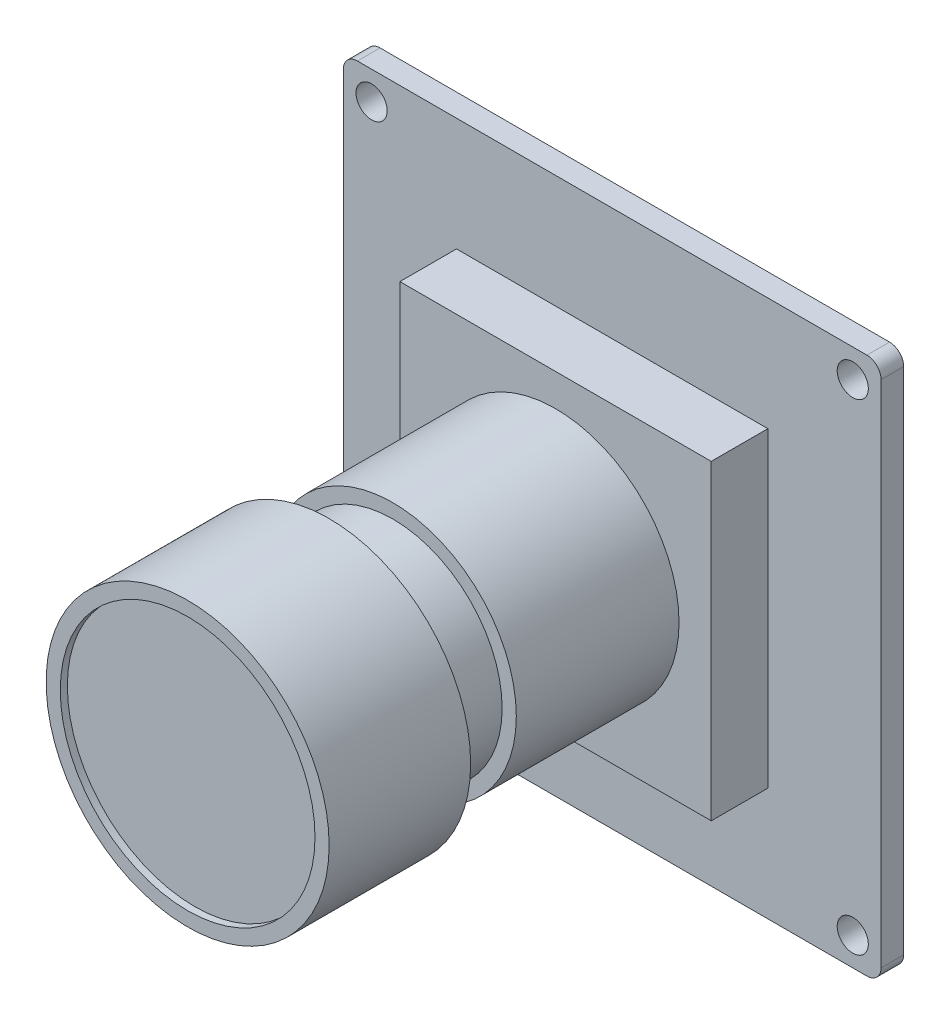
ISO-10303-21;
HEADER;
FILE_DESCRIPTION(('STEP AP214'),'2;1');
FILE_NAME('part.step','',(''),(''),'','','');
FILE_SCHEMA(('AUTOMOTIVE_DESIGN { 1 0 10303 214 1 1 1 1 }'));
ENDSEC;
DATA;
#1=APPLICATION_CONTEXT('core data for automotive mechanical design processes');
#2=APPLICATION_PROTOCOL_DEFINITION('international standard','automotive_design',2000,#1);
#3=PRODUCT_CONTEXT('',#1,'mechanical');
#4=PRODUCT('Part','Part','',(#3));
#5=PRODUCT_RELATED_PRODUCT_CATEGORY('part','',(#4));
#6=PRODUCT_DEFINITION_FORMATION('','',#4);
#7=PRODUCT_DEFINITION_CONTEXT('part definition',#1,'design');
#8=PRODUCT_DEFINITION('design','',#6,#7);
#9=PRODUCT_DEFINITION_SHAPE('','',#8);
#10=(LENGTH_UNIT() NAMED_UNIT(*) SI_UNIT(.MILLI.,.METRE.));
#11=(NAMED_UNIT(*) PLANE_ANGLE_UNIT() SI_UNIT($,.RADIAN.));
#12=(NAMED_UNIT(*) SI_UNIT($,.STERADIAN.) SOLID_ANGLE_UNIT());
#13=UNCERTAINTY_MEASURE_WITH_UNIT(LENGTH_MEASURE(1.E-05),#10,'distance_accuracy_value','');
#14=(GEOMETRIC_REPRESENTATION_CONTEXT(3) GLOBAL_UNCERTAINTY_ASSIGNED_CONTEXT((#13)) GLOBAL_UNIT_ASSIGNED_CONTEXT((#10,
#11,#12)) REPRESENTATION_CONTEXT('',''));
#15=CARTESIAN_POINT('',(0.,0.,0.));
#16=DIRECTION('',(0.,0.,1.));
#17=DIRECTION('',(1.,0.,0.));
#18=AXIS2_PLACEMENT_3D('',#15,#16,#17);
#19=CARTESIAN_POINT('',(0.,0.,31.6));
#20=DIRECTION('',(0.,0.,-1.));
#21=DIRECTION('',(-1.,0.,0.));
#22=AXIS2_PLACEMENT_3D('',#19,#20,#21);
#23=CYLINDRICAL_SURFACE('',#22,7.725);
#24=CARTESIAN_POINT('',(0.,0.,17.1));
#25=DIRECTION('',(0.,0.,1.));
#26=DIRECTION('',(1.,0.,0.));
#27=AXIS2_PLACEMENT_3D('',#24,#25,#26);
#28=CIRCLE('',#27,7.725);
#29=CARTESIAN_POINT('',(7.725,0.,17.1));
#30=VERTEX_POINT('',#29);
#31=EDGE_CURVE('E238',#30,#30,#28,.F.);
#32=ORIENTED_EDGE('',*,*,#31,.F.);
#33=EDGE_LOOP('',(#32));
#34=FACE_BOUND('',#33,.T.);
#35=CARTESIAN_POINT('',(0.,0.,21.6));
#36=DIRECTION('',(0.,0.,1.));
#37=DIRECTION('',(1.,0.,0.));
#38=AXIS2_PLACEMENT_3D('',#35,#36,#37);
#39=CIRCLE('',#38,7.725);
#40=CARTESIAN_POINT('',(7.725,0.,21.6));
#41=VERTEX_POINT('',#40);
#42=EDGE_CURVE('E11',#41,#41,#39,.T.);
#43=ORIENTED_EDGE('',*,*,#42,.F.);
#44=EDGE_LOOP('',(#43));
#45=FACE_BOUND('',#44,.T.);
#46=ADVANCED_FACE('F35',(#34,#45),#23,.T.);
#47=CARTESIAN_POINT('',(0.,0.,1.6));
#48=DIRECTION('',(0.,0.,1.));
#49=DIRECTION('',(1.,0.,0.));
#50=AXIS2_PLACEMENT_3D('',#47,#48,#49);
#51=PLANE('',#50);
#52=CARTESIAN_POINT('',(-17.,-17.,1.6));
#53=DIRECTION('',(0.,0.,1.));
#54=DIRECTION('',(1.,0.,0.));
#55=AXIS2_PLACEMENT_3D('',#52,#53,#54);
#56=CIRCLE('',#55,1.1);
#57=CARTESIAN_POINT('',(-15.9,-17.,1.6));
#58=VERTEX_POINT('',#57);
#59=EDGE_CURVE('E151',#58,#58,#56,.T.);
#60=ORIENTED_EDGE('',*,*,#59,.F.);
#61=EDGE_LOOP('',(#60));
#62=FACE_BOUND('',#61,.T.);
#63=CARTESIAN_POINT('',(17.,17.,1.6));
#64=DIRECTION('',(0.,0.,1.));
#65=DIRECTION('',(1.,0.,0.));
#66=AXIS2_PLACEMENT_3D('',#63,#64,#65);
#67=CIRCLE('',#66,1.1);
#68=CARTESIAN_POINT('',(18.1,17.,1.6));
#69=VERTEX_POINT('',#68);
#70=EDGE_CURVE('E169',#69,#69,#67,.T.);
#71=ORIENTED_EDGE('',*,*,#70,.F.);
#72=EDGE_LOOP('',(#71));
#73=FACE_BOUND('',#72,.T.);
#74=CARTESIAN_POINT('',(17.,-17.,1.6));
#75=DIRECTION('',(0.,0.,1.));
#76=DIRECTION('',(1.,0.,0.));
#77=AXIS2_PLACEMENT_3D('',#74,#75,#76);
#78=CIRCLE('',#77,1.1);
#79=CARTESIAN_POINT('',(18.1,-17.,1.6));
#80=VERTEX_POINT('',#79);
#81=EDGE_CURVE('E163',#80,#80,#78,.T.);
#82=ORIENTED_EDGE('',*,*,#81,.F.);
#83=EDGE_LOOP('',(#82));
#84=FACE_BOUND('',#83,.T.);
#85=CARTESIAN_POINT('',(-17.,17.,1.6));
#86=DIRECTION('',(0.,0.,1.));
#87=DIRECTION('',(1.,0.,0.));
#88=AXIS2_PLACEMENT_3D('',#85,#86,#87);
#89=CIRCLE('',#88,1.1);
#90=CARTESIAN_POINT('',(-15.9,17.,1.6));
#91=VERTEX_POINT('',#90);
#92=EDGE_CURVE('E162',#91,#91,#89,.T.);
#93=ORIENTED_EDGE('',*,*,#92,.F.);
#94=EDGE_LOOP('',(#93));
#95=FACE_BOUND('',#94,.T.);
#96=DIRECTION('',(0.,-1.,0.));
#97=VECTOR('',#96,1.);
#98=CARTESIAN_POINT('',(-19.,19.,1.6));
#99=LINE('',#98,#97);
#100=CARTESIAN_POINT('',(-19.,18.,1.6));
#101=VERTEX_POINT('',#100);
#102=CARTESIAN_POINT('',(-19.,-18.,1.6));
#103=VERTEX_POINT('',#102);
#104=EDGE_CURVE('E180',#101,#103,#99,.T.);
#105=ORIENTED_EDGE('',*,*,#104,.T.);
#106=CARTESIAN_POINT('',(-18.,-18.,1.6));
#107=DIRECTION('',(0.,0.,1.));
#108=DIRECTION('',(1.,0.,0.));
#109=AXIS2_PLACEMENT_3D('',#106,#107,#108);
#110=CIRCLE('',#109,1.);
#111=CARTESIAN_POINT('',(-18.,-19.,1.6));
#112=VERTEX_POINT('',#111);
#113=EDGE_CURVE('E225',#103,#112,#110,.T.);
#114=ORIENTED_EDGE('',*,*,#113,.T.);
#115=DIRECTION('',(1.,0.,0.));
#116=VECTOR('',#115,1.);
#117=CARTESIAN_POINT('',(-19.,-19.,1.6));
#118=LINE('',#117,#116);
#119=CARTESIAN_POINT('',(18.,-19.,1.6));
#120=VERTEX_POINT('',#119);
#121=EDGE_CURVE('E183',#112,#120,#118,.T.);
#122=ORIENTED_EDGE('',*,*,#121,.T.);
#123=CARTESIAN_POINT('',(18.,-18.,1.6));
#124=DIRECTION('',(0.,0.,1.));
#125=DIRECTION('',(1.,0.,0.));
#126=AXIS2_PLACEMENT_3D('',#123,#124,#125);
#127=CIRCLE('',#126,1.);
#128=CARTESIAN_POINT('',(19.,-18.,1.6));
#129=VERTEX_POINT('',#128);
#130=EDGE_CURVE('E223',#120,#129,#127,.T.);
#131=ORIENTED_EDGE('',*,*,#130,.T.);
#132=DIRECTION('',(0.,1.,0.));
#133=VECTOR('',#132,1.);
#134=CARTESIAN_POINT('',(19.,19.,1.6));
#135=LINE('',#134,#133);
#136=CARTESIAN_POINT('',(19.,18.,1.6));
#137=VERTEX_POINT('',#136);
#138=EDGE_CURVE('E187',#129,#137,#135,.T.);
#139=ORIENTED_EDGE('',*,*,#138,.T.);
#140=CARTESIAN_POINT('',(18.,18.,1.6));
#141=DIRECTION('',(0.,0.,1.));
#142=DIRECTION('',(1.,0.,0.));
#143=AXIS2_PLACEMENT_3D('',#140,#141,#142);
#144=CIRCLE('',#143,1.);
#145=CARTESIAN_POINT('',(18.,19.,1.6));
#146=VERTEX_POINT('',#145);
#147=EDGE_CURVE('E221',#137,#146,#144,.T.);
#148=ORIENTED_EDGE('',*,*,#147,.T.);
#149=DIRECTION('',(-1.,0.,0.));
#150=VECTOR('',#149,1.);
#151=CARTESIAN_POINT('',(-19.,19.,1.6));
#152=LINE('',#151,#150);
#153=CARTESIAN_POINT('',(-18.,19.,1.6));
#154=VERTEX_POINT('',#153);
#155=EDGE_CURVE('E190',#146,#154,#152,.T.);
#156=ORIENTED_EDGE('',*,*,#155,.T.);
#157=CARTESIAN_POINT('',(-18.,18.,1.6));
#158=DIRECTION('',(0.,0.,1.));
#159=DIRECTION('',(1.,0.,0.));
#160=AXIS2_PLACEMENT_3D('',#157,#158,#159);
#161=CIRCLE('',#160,1.);
#162=EDGE_CURVE('E219',#154,#101,#161,.T.);
#163=ORIENTED_EDGE('',*,*,#162,.T.);
#164=EDGE_LOOP('',(#105,#114,#122,#131,#139,#148,#156,#163));
#165=FACE_BOUND('',#164,.T.);
#166=DIRECTION('',(1.,0.,0.));
#167=VECTOR('',#166,1.);
#168=CARTESIAN_POINT('',(-11.,-11.,1.6));
#169=LINE('',#168,#167);
#170=CARTESIAN_POINT('',(-11.,-11.,1.6));
#171=VERTEX_POINT('',#170);
#172=CARTESIAN_POINT('',(11.,-11.,1.6));
#173=VERTEX_POINT('',#172);
#174=EDGE_CURVE('E261',#171,#173,#169,.T.);
#175=ORIENTED_EDGE('',*,*,#174,.F.);
#176=DIRECTION('',(0.,-1.,0.));
#177=VECTOR('',#176,1.);
#178=CARTESIAN_POINT('',(-11.,11.,1.6));
#179=LINE('',#178,#177);
#180=CARTESIAN_POINT('',(-11.,11.,1.6));
#181=VERTEX_POINT('',#180);
#182=EDGE_CURVE('E149',#181,#171,#179,.T.);
#183=ORIENTED_EDGE('',*,*,#182,.F.);
#184=DIRECTION('',(-1.,0.,0.));
#185=VECTOR('',#184,1.);
#186=CARTESIAN_POINT('',(-11.,11.,1.6));
#187=LINE('',#186,#185);
#188=CARTESIAN_POINT('',(11.,11.,1.6));
#189=VERTEX_POINT('',#188);
#190=EDGE_CURVE('E145',#189,#181,#187,.T.);
#191=ORIENTED_EDGE('',*,*,#190,.F.);
#192=DIRECTION('',(0.,1.,0.));
#193=VECTOR('',#192,1.);
#194=CARTESIAN_POINT('',(11.,11.,1.6));
#195=LINE('',#194,#193);
#196=EDGE_CURVE('E263',#173,#189,#195,.T.);
#197=ORIENTED_EDGE('',*,*,#196,.F.);
#198=EDGE_LOOP('',(#175,#183,#191,#197));
#199=FACE_BOUND('',#198,.T.);
#200=ADVANCED_FACE('F268',(#62,#73,#84,#95,#165,#199),#51,.T.);
#201=CARTESIAN_POINT('',(-19.,19.,1.6));
#202=DIRECTION('',(1.,0.,0.));
#203=DIRECTION('',(0.,1.,0.));
#204=AXIS2_PLACEMENT_3D('',#201,#202,#203);
#205=PLANE('',#204);
#206=DIRECTION('',(0.,-1.,0.));
#207=VECTOR('',#206,1.);
#208=CARTESIAN_POINT('',(-19.,19.,0.));
#209=LINE('',#208,#207);
#210=CARTESIAN_POINT('',(-19.,18.,0.));
#211=VERTEX_POINT('',#210);
#212=CARTESIAN_POINT('',(-19.,-18.,0.));
#213=VERTEX_POINT('',#212);
#214=EDGE_CURVE('E177',#211,#213,#209,.T.);
#215=ORIENTED_EDGE('',*,*,#214,.T.);
#216=DIRECTION('',(0.,0.,-1.));
#217=VECTOR('',#216,1.);
#218=CARTESIAN_POINT('',(-19.,-18.,1.6));
#219=LINE('',#218,#217);
#220=EDGE_CURVE('E217',#213,#103,#219,.F.);
#221=ORIENTED_EDGE('',*,*,#220,.T.);
#222=ORIENTED_EDGE('',*,*,#104,.F.);
#223=DIRECTION('',(0.,0.,-1.));
#224=VECTOR('',#223,1.);
#225=CARTESIAN_POINT('',(-19.,18.,1.6));
#226=LINE('',#225,#224);
#227=EDGE_CURVE('E214',#101,#211,#226,.T.);
#228=ORIENTED_EDGE('',*,*,#227,.T.);
#229=EDGE_LOOP('',(#215,#221,#222,#228));
#230=FACE_BOUND('',#229,.T.);
#231=ADVANCED_FACE('F289',(#230),#205,.F.);
#232=CARTESIAN_POINT('',(-19.,-19.,1.6));
#233=DIRECTION('',(0.,1.,0.));
#234=DIRECTION('',(0.,0.,1.));
#235=AXIS2_PLACEMENT_3D('',#232,#233,#234);
#236=PLANE('',#235);
#237=ORIENTED_EDGE('',*,*,#121,.F.);
#238=DIRECTION('',(0.,0.,-1.));
#239=VECTOR('',#238,1.);
#240=CARTESIAN_POINT('',(-18.,-19.,1.6));
#241=LINE('',#240,#239);
#242=CARTESIAN_POINT('',(-18.,-19.,0.));
#243=VERTEX_POINT('',#242);
#244=EDGE_CURVE('E203',#112,#243,#241,.T.);
#245=ORIENTED_EDGE('',*,*,#244,.T.);
#246=DIRECTION('',(1.,0.,0.));
#247=VECTOR('',#246,1.);
#248=CARTESIAN_POINT('',(-19.,-19.,0.));
#249=LINE('',#248,#247);
#250=CARTESIAN_POINT('',(18.,-19.,0.));
#251=VERTEX_POINT('',#250);
#252=EDGE_CURVE('E195',#243,#251,#249,.T.);
#253=ORIENTED_EDGE('',*,*,#252,.T.);
#254=DIRECTION('',(0.,0.,-1.));
#255=VECTOR('',#254,1.);
#256=CARTESIAN_POINT('',(18.,-19.,1.6));
#257=LINE('',#256,#255);
#258=EDGE_CURVE('E192',#251,#120,#257,.F.);
#259=ORIENTED_EDGE('',*,*,#258,.T.);
#260=EDGE_LOOP('',(#237,#245,#253,#259));
#261=FACE_BOUND('',#260,.T.);
#262=ADVANCED_FACE('F511',(#261),#236,.F.);
#263=CARTESIAN_POINT('',(19.,19.,1.6));
#264=DIRECTION('',(-1.,0.,0.));
#265=DIRECTION('',(0.,0.,1.));
#266=AXIS2_PLACEMENT_3D('',#263,#264,#265);
#267=PLANE('',#266);
#268=ORIENTED_EDGE('',*,*,#138,.F.);
#269=DIRECTION('',(0.,0.,-1.));
#270=VECTOR('',#269,1.);
#271=CARTESIAN_POINT('',(19.,-18.,1.6));
#272=LINE('',#271,#270);
#273=CARTESIAN_POINT('',(19.,-18.,0.));
#274=VERTEX_POINT('',#273);
#275=EDGE_CURVE('E229',#129,#274,#272,.T.);
#276=ORIENTED_EDGE('',*,*,#275,.T.);
#277=DIRECTION('',(0.,1.,0.));
#278=VECTOR('',#277,1.);
#279=CARTESIAN_POINT('',(19.,19.,0.));
#280=LINE('',#279,#278);
#281=CARTESIAN_POINT('',(19.,18.,0.));
#282=VERTEX_POINT('',#281);
#283=EDGE_CURVE('E198',#274,#282,#280,.T.);
#284=ORIENTED_EDGE('',*,*,#283,.T.);
#285=DIRECTION('',(0.,0.,-1.));
#286=VECTOR('',#285,1.);
#287=CARTESIAN_POINT('',(19.,18.,1.6));
#288=LINE('',#287,#286);
#289=EDGE_CURVE('E227',#282,#137,#288,.F.);
#290=ORIENTED_EDGE('',*,*,#289,.T.);
#291=EDGE_LOOP('',(#268,#276,#284,#290));
#292=FACE_BOUND('',#291,.T.);
#293=ADVANCED_FACE('F503',(#292),#267,.F.);
#294=CARTESIAN_POINT('',(-19.,19.,1.6));
#295=DIRECTION('',(0.,-1.,0.));
#296=DIRECTION('',(0.,0.,-1.));
#297=AXIS2_PLACEMENT_3D('',#294,#295,#296);
#298=PLANE('',#297);
#299=ORIENTED_EDGE('',*,*,#155,.F.);
#300=DIRECTION('',(0.,0.,-1.));
#301=VECTOR('',#300,1.);
#302=CARTESIAN_POINT('',(18.,19.,1.6));
#303=LINE('',#302,#301);
#304=CARTESIAN_POINT('',(18.,19.,0.));
#305=VERTEX_POINT('',#304);
#306=EDGE_CURVE('E43',#146,#305,#303,.T.);
#307=ORIENTED_EDGE('',*,*,#306,.T.);
#308=DIRECTION('',(-1.,0.,0.));
#309=VECTOR('',#308,1.);
#310=CARTESIAN_POINT('',(-19.,19.,0.));
#311=LINE('',#310,#309);
#312=CARTESIAN_POINT('',(-18.,19.,0.));
#313=VERTEX_POINT('',#312);
#314=EDGE_CURVE('E184',#305,#313,#311,.T.);
#315=ORIENTED_EDGE('',*,*,#314,.T.);
#316=DIRECTION('',(0.,0.,-1.));
#317=VECTOR('',#316,1.);
#318=CARTESIAN_POINT('',(-18.,19.,1.6));
#319=LINE('',#318,#317);
#320=EDGE_CURVE('E58',#313,#154,#319,.F.);
#321=ORIENTED_EDGE('',*,*,#320,.T.);
#322=EDGE_LOOP('',(#299,#307,#315,#321));
#323=FACE_BOUND('',#322,.T.);
#324=ADVANCED_FACE('F494',(#323),#298,.F.);
#325=CARTESIAN_POINT('',(0.,0.,0.));
#326=DIRECTION('',(0.,0.,1.));
#327=DIRECTION('',(1.,0.,0.));
#328=AXIS2_PLACEMENT_3D('',#325,#326,#327);
#329=PLANE('',#328);
#330=CARTESIAN_POINT('',(-17.,-17.,0.));
#331=DIRECTION('',(0.,0.,1.));
#332=DIRECTION('',(1.,0.,0.));
#333=AXIS2_PLACEMENT_3D('',#330,#331,#332);
#334=CIRCLE('',#333,1.1);
#335=CARTESIAN_POINT('',(-15.9,-17.,0.));
#336=VERTEX_POINT('',#335);
#337=EDGE_CURVE('E154',#336,#336,#334,.T.);
#338=ORIENTED_EDGE('',*,*,#337,.T.);
#339=EDGE_LOOP('',(#338));
#340=FACE_BOUND('',#339,.T.);
#341=CARTESIAN_POINT('',(17.,17.,0.));
#342=DIRECTION('',(0.,0.,1.));
#343=DIRECTION('',(1.,0.,0.));
#344=AXIS2_PLACEMENT_3D('',#341,#342,#343);
#345=CIRCLE('',#344,1.1);
#346=CARTESIAN_POINT('',(18.1,17.,0.));
#347=VERTEX_POINT('',#346);
#348=EDGE_CURVE('E166',#347,#347,#345,.T.);
#349=ORIENTED_EDGE('',*,*,#348,.T.);
#350=EDGE_LOOP('',(#349));
#351=FACE_BOUND('',#350,.T.);
#352=CARTESIAN_POINT('',(17.,-17.,0.));
#353=DIRECTION('',(0.,0.,1.));
#354=DIRECTION('',(1.,0.,0.));
#355=AXIS2_PLACEMENT_3D('',#352,#353,#354);
#356=CIRCLE('',#355,1.1);
#357=CARTESIAN_POINT('',(18.1,-17.,0.));
#358=VERTEX_POINT('',#357);
#359=EDGE_CURVE('E159',#358,#358,#356,.T.);
#360=ORIENTED_EDGE('',*,*,#359,.T.);
#361=EDGE_LOOP('',(#360));
#362=FACE_BOUND('',#361,.T.);
#363=CARTESIAN_POINT('',(-17.,17.,0.));
#364=DIRECTION('',(0.,0.,1.));
#365=DIRECTION('',(1.,0.,0.));
#366=AXIS2_PLACEMENT_3D('',#363,#364,#365);
#367=CIRCLE('',#366,1.1);
#368=CARTESIAN_POINT('',(-15.9,17.,0.));
#369=VERTEX_POINT('',#368);
#370=EDGE_CURVE('E174',#369,#369,#367,.T.);
#371=ORIENTED_EDGE('',*,*,#370,.T.);
#372=EDGE_LOOP('',(#371));
#373=FACE_BOUND('',#372,.T.);
#374=ORIENTED_EDGE('',*,*,#252,.F.);
#375=CARTESIAN_POINT('',(-18.,-18.,0.));
#376=DIRECTION('',(0.,0.,1.));
#377=DIRECTION('',(1.,0.,0.));
#378=AXIS2_PLACEMENT_3D('',#375,#376,#377);
#379=CIRCLE('',#378,1.);
#380=EDGE_CURVE('E212',#243,#213,#379,.F.);
#381=ORIENTED_EDGE('',*,*,#380,.T.);
#382=ORIENTED_EDGE('',*,*,#214,.F.);
#383=CARTESIAN_POINT('',(-18.,18.,0.));
#384=DIRECTION('',(0.,0.,1.));
#385=DIRECTION('',(1.,0.,0.));
#386=AXIS2_PLACEMENT_3D('',#383,#384,#385);
#387=CIRCLE('',#386,1.);
#388=EDGE_CURVE('E206',#211,#313,#387,.F.);
#389=ORIENTED_EDGE('',*,*,#388,.T.);
#390=ORIENTED_EDGE('',*,*,#314,.F.);
#391=CARTESIAN_POINT('',(18.,18.,0.));
#392=DIRECTION('',(0.,0.,1.));
#393=DIRECTION('',(1.,0.,0.));
#394=AXIS2_PLACEMENT_3D('',#391,#392,#393);
#395=CIRCLE('',#394,1.);
#396=EDGE_CURVE('E208',#305,#282,#395,.F.);
#397=ORIENTED_EDGE('',*,*,#396,.T.);
#398=ORIENTED_EDGE('',*,*,#283,.F.);
#399=CARTESIAN_POINT('',(18.,-18.,0.));
#400=DIRECTION('',(0.,0.,1.));
#401=DIRECTION('',(1.,0.,0.));
#402=AXIS2_PLACEMENT_3D('',#399,#400,#401);
#403=CIRCLE('',#402,1.);
#404=EDGE_CURVE('E210',#274,#251,#403,.F.);
#405=ORIENTED_EDGE('',*,*,#404,.T.);
#406=EDGE_LOOP('',(#374,#381,#382,#389,#390,#397,#398,#405));
#407=FACE_BOUND('',#406,.T.);
#408=ADVANCED_FACE('F486',(#340,#351,#362,#373,#407),#329,.F.);
#409=CARTESIAN_POINT('',(-17.,17.,0.));
#410=DIRECTION('',(0.,0.,1.));
#411=DIRECTION('',(1.,0.,0.));
#412=AXIS2_PLACEMENT_3D('',#409,#410,#411);
#413=CYLINDRICAL_SURFACE('',#412,1.1);
#414=ORIENTED_EDGE('',*,*,#370,.F.);
#415=EDGE_LOOP('',(#414));
#416=FACE_BOUND('',#415,.T.);
#417=ORIENTED_EDGE('',*,*,#92,.T.);
#418=EDGE_LOOP('',(#417));
#419=FACE_BOUND('',#418,.T.);
#420=ADVANCED_FACE('F477',(#416,#419),#413,.F.);
#421=CARTESIAN_POINT('',(17.,-17.,0.));
#422=DIRECTION('',(0.,0.,1.));
#423=DIRECTION('',(1.,0.,0.));
#424=AXIS2_PLACEMENT_3D('',#421,#422,#423);
#425=CYLINDRICAL_SURFACE('',#424,1.1);
#426=ORIENTED_EDGE('',*,*,#359,.F.);
#427=EDGE_LOOP('',(#426));
#428=FACE_BOUND('',#427,.T.);
#429=ORIENTED_EDGE('',*,*,#81,.T.);
#430=EDGE_LOOP('',(#429));
#431=FACE_BOUND('',#430,.T.);
#432=ADVANCED_FACE('F468',(#428,#431),#425,.F.);
#433=CARTESIAN_POINT('',(17.,17.,0.));
#434=DIRECTION('',(0.,0.,1.));
#435=DIRECTION('',(1.,0.,0.));
#436=AXIS2_PLACEMENT_3D('',#433,#434,#435);
#437=CYLINDRICAL_SURFACE('',#436,1.1);
#438=ORIENTED_EDGE('',*,*,#348,.F.);
#439=EDGE_LOOP('',(#438));
#440=FACE_BOUND('',#439,.T.);
#441=ORIENTED_EDGE('',*,*,#70,.T.);
#442=EDGE_LOOP('',(#441));
#443=FACE_BOUND('',#442,.T.);
#444=ADVANCED_FACE('F458',(#440,#443),#437,.F.);
#445=CARTESIAN_POINT('',(-17.,-17.,0.));
#446=DIRECTION('',(0.,0.,1.));
#447=DIRECTION('',(1.,0.,0.));
#448=AXIS2_PLACEMENT_3D('',#445,#446,#447);
#449=CYLINDRICAL_SURFACE('',#448,1.1);
#450=ORIENTED_EDGE('',*,*,#337,.F.);
#451=EDGE_LOOP('',(#450));
#452=FACE_BOUND('',#451,.T.);
#453=ORIENTED_EDGE('',*,*,#59,.T.);
#454=EDGE_LOOP('',(#453));
#455=FACE_BOUND('',#454,.T.);
#456=ADVANCED_FACE('F448',(#452,#455),#449,.F.);
#457=CARTESIAN_POINT('',(-18.,-18.,1.6));
#458=DIRECTION('',(0.,0.,-1.));
#459=DIRECTION('',(-1.,0.,0.));
#460=AXIS2_PLACEMENT_3D('',#457,#458,#459);
#461=CYLINDRICAL_SURFACE('',#460,1.);
#462=ORIENTED_EDGE('',*,*,#113,.F.);
#463=ORIENTED_EDGE('',*,*,#220,.F.);
#464=ORIENTED_EDGE('',*,*,#380,.F.);
#465=ORIENTED_EDGE('',*,*,#244,.F.);
#466=EDGE_LOOP('',(#462,#463,#464,#465));
#467=FACE_BOUND('',#466,.T.);
#468=ADVANCED_FACE('F439',(#467),#461,.T.);
#469=CARTESIAN_POINT('',(18.,-18.,1.6));
#470=DIRECTION('',(0.,0.,-1.));
#471=DIRECTION('',(-1.,0.,0.));
#472=AXIS2_PLACEMENT_3D('',#469,#470,#471);
#473=CYLINDRICAL_SURFACE('',#472,1.);
#474=ORIENTED_EDGE('',*,*,#130,.F.);
#475=ORIENTED_EDGE('',*,*,#258,.F.);
#476=ORIENTED_EDGE('',*,*,#404,.F.);
#477=ORIENTED_EDGE('',*,*,#275,.F.);
#478=EDGE_LOOP('',(#474,#475,#476,#477));
#479=FACE_BOUND('',#478,.T.);
#480=ADVANCED_FACE('F431',(#479),#473,.T.);
#481=CARTESIAN_POINT('',(18.,18.,1.6));
#482=DIRECTION('',(0.,0.,-1.));
#483=DIRECTION('',(-1.,0.,0.));
#484=AXIS2_PLACEMENT_3D('',#481,#482,#483);
#485=CYLINDRICAL_SURFACE('',#484,1.);
#486=ORIENTED_EDGE('',*,*,#147,.F.);
#487=ORIENTED_EDGE('',*,*,#289,.F.);
#488=ORIENTED_EDGE('',*,*,#396,.F.);
#489=ORIENTED_EDGE('',*,*,#306,.F.);
#490=EDGE_LOOP('',(#486,#487,#488,#489));
#491=FACE_BOUND('',#490,.T.);
#492=ADVANCED_FACE('F423',(#491),#485,.T.);
#493=CARTESIAN_POINT('',(-18.,18.,1.6));
#494=DIRECTION('',(0.,0.,-1.));
#495=DIRECTION('',(-1.,0.,0.));
#496=AXIS2_PLACEMENT_3D('',#493,#494,#495);
#497=CYLINDRICAL_SURFACE('',#496,1.);
#498=ORIENTED_EDGE('',*,*,#162,.F.);
#499=ORIENTED_EDGE('',*,*,#320,.F.);
#500=ORIENTED_EDGE('',*,*,#388,.F.);
#501=ORIENTED_EDGE('',*,*,#227,.F.);
#502=EDGE_LOOP('',(#498,#499,#500,#501));
#503=FACE_BOUND('',#502,.T.);
#504=ADVANCED_FACE('F37',(#503),#497,.T.);
#505=CARTESIAN_POINT('',(-11.,11.,5.6));
#506=DIRECTION('',(1.,0.,0.));
#507=DIRECTION('',(0.,1.,0.));
#508=AXIS2_PLACEMENT_3D('',#505,#506,#507);
#509=PLANE('',#508);
#510=ORIENTED_EDGE('',*,*,#182,.T.);
#511=DIRECTION('',(0.,0.,-1.));
#512=VECTOR('',#511,1.);
#513=CARTESIAN_POINT('',(-11.,-11.,5.6));
#514=LINE('',#513,#512);
#515=CARTESIAN_POINT('',(-11.,-11.,5.6));
#516=VERTEX_POINT('',#515);
#517=EDGE_CURVE('E130',#516,#171,#514,.T.);
#518=ORIENTED_EDGE('',*,*,#517,.F.);
#519=DIRECTION('',(0.,-1.,0.));
#520=VECTOR('',#519,1.);
#521=CARTESIAN_POINT('',(-11.,11.,5.6));
#522=LINE('',#521,#520);
#523=CARTESIAN_POINT('',(-11.,11.,5.6));
#524=VERTEX_POINT('',#523);
#525=EDGE_CURVE('E137',#524,#516,#522,.T.);
#526=ORIENTED_EDGE('',*,*,#525,.F.);
#527=DIRECTION('',(0.,0.,-1.));
#528=VECTOR('',#527,1.);
#529=CARTESIAN_POINT('',(-11.,11.,5.6));
#530=LINE('',#529,#528);
#531=EDGE_CURVE('E259',#524,#181,#530,.T.);
#532=ORIENTED_EDGE('',*,*,#531,.T.);
#533=EDGE_LOOP('',(#510,#518,#526,#532));
#534=FACE_BOUND('',#533,.T.);
#535=ADVANCED_FACE('F147',(#534),#509,.F.);
#536=CARTESIAN_POINT('',(-11.,-11.,5.6));
#537=DIRECTION('',(0.,1.,0.));
#538=DIRECTION('',(0.,0.,1.));
#539=AXIS2_PLACEMENT_3D('',#536,#537,#538);
#540=PLANE('',#539);
#541=ORIENTED_EDGE('',*,*,#174,.T.);
#542=DIRECTION('',(0.,0.,-1.));
#543=VECTOR('',#542,1.);
#544=CARTESIAN_POINT('',(11.,-11.,5.6));
#545=LINE('',#544,#543);
#546=CARTESIAN_POINT('',(11.,-11.,5.6));
#547=VERTEX_POINT('',#546);
#548=EDGE_CURVE('E133',#547,#173,#545,.T.);
#549=ORIENTED_EDGE('',*,*,#548,.F.);
#550=DIRECTION('',(1.,0.,0.));
#551=VECTOR('',#550,1.);
#552=CARTESIAN_POINT('',(-11.,-11.,5.6));
#553=LINE('',#552,#551);
#554=EDGE_CURVE('E126',#516,#547,#553,.T.);
#555=ORIENTED_EDGE('',*,*,#554,.F.);
#556=ORIENTED_EDGE('',*,*,#517,.T.);
#557=EDGE_LOOP('',(#541,#549,#555,#556));
#558=FACE_BOUND('',#557,.T.);
#559=ADVANCED_FACE('F128',(#558),#540,.F.);
#560=CARTESIAN_POINT('',(11.,11.,5.6));
#561=DIRECTION('',(-1.,0.,0.));
#562=DIRECTION('',(0.,-1.,0.));
#563=AXIS2_PLACEMENT_3D('',#560,#561,#562);
#564=PLANE('',#563);
#565=ORIENTED_EDGE('',*,*,#196,.T.);
#566=DIRECTION('',(0.,0.,-1.));
#567=VECTOR('',#566,1.);
#568=CARTESIAN_POINT('',(11.,11.,5.6));
#569=LINE('',#568,#567);
#570=CARTESIAN_POINT('',(11.,11.,5.6));
#571=VERTEX_POINT('',#570);
#572=EDGE_CURVE('E50',#571,#189,#569,.T.);
#573=ORIENTED_EDGE('',*,*,#572,.F.);
#574=DIRECTION('',(0.,1.,0.));
#575=VECTOR('',#574,1.);
#576=CARTESIAN_POINT('',(11.,11.,5.6));
#577=LINE('',#576,#575);
#578=EDGE_CURVE('E136',#547,#571,#577,.T.);
#579=ORIENTED_EDGE('',*,*,#578,.F.);
#580=ORIENTED_EDGE('',*,*,#548,.T.);
#581=EDGE_LOOP('',(#565,#573,#579,#580));
#582=FACE_BOUND('',#581,.T.);
#583=ADVANCED_FACE('F271',(#582),#564,.F.);
#584=CARTESIAN_POINT('',(-11.,11.,5.6));
#585=DIRECTION('',(0.,-1.,0.));
#586=DIRECTION('',(0.,0.,-1.));
#587=AXIS2_PLACEMENT_3D('',#584,#585,#586);
#588=PLANE('',#587);
#589=ORIENTED_EDGE('',*,*,#190,.T.);
#590=ORIENTED_EDGE('',*,*,#531,.F.);
#591=DIRECTION('',(-1.,0.,0.));
#592=VECTOR('',#591,1.);
#593=CARTESIAN_POINT('',(-11.,11.,5.6));
#594=LINE('',#593,#592);
#595=EDGE_CURVE('E141',#571,#524,#594,.T.);
#596=ORIENTED_EDGE('',*,*,#595,.F.);
#597=ORIENTED_EDGE('',*,*,#572,.T.);
#598=EDGE_LOOP('',(#589,#590,#596,#597));
#599=FACE_BOUND('',#598,.T.);
#600=ADVANCED_FACE('F272',(#599),#588,.F.);
#601=CARTESIAN_POINT('',(0.,0.,5.6));
#602=DIRECTION('',(0.,0.,1.));
#603=DIRECTION('',(1.,0.,0.));
#604=AXIS2_PLACEMENT_3D('',#601,#602,#603);
#605=PLANE('',#604);
#606=CARTESIAN_POINT('',(0.,0.,5.6));
#607=DIRECTION('',(0.,0.,1.));
#608=DIRECTION('',(1.,0.,0.));
#609=AXIS2_PLACEMENT_3D('',#606,#607,#608);
#610=CIRCLE('',#609,8.725);
#611=CARTESIAN_POINT('',(8.725,0.,5.6));
#612=VERTEX_POINT('',#611);
#613=EDGE_CURVE('E235',#612,#612,#610,.F.);
#614=ORIENTED_EDGE('',*,*,#613,.T.);
#615=EDGE_LOOP('',(#614));
#616=FACE_BOUND('',#615,.T.);
#617=ORIENTED_EDGE('',*,*,#525,.T.);
#618=ORIENTED_EDGE('',*,*,#554,.T.);
#619=ORIENTED_EDGE('',*,*,#578,.T.);
#620=ORIENTED_EDGE('',*,*,#595,.T.);
#621=EDGE_LOOP('',(#617,#618,#619,#620));
#622=FACE_BOUND('',#621,.T.);
#623=ADVANCED_FACE('F140',(#616,#622),#605,.T.);
#624=CARTESIAN_POINT('',(0.,0.,17.1));
#625=DIRECTION('',(0.,0.,-1.));
#626=DIRECTION('',(-1.,0.,0.));
#627=AXIS2_PLACEMENT_3D('',#624,#625,#626);
#628=CYLINDRICAL_SURFACE('',#627,8.725);
#629=ORIENTED_EDGE('',*,*,#613,.F.);
#630=EDGE_LOOP('',(#629));
#631=FACE_BOUND('',#630,.T.);
#632=CARTESIAN_POINT('',(0.,0.,17.1));
#633=DIRECTION('',(0.,0.,1.));
#634=DIRECTION('',(1.,0.,0.));
#635=AXIS2_PLACEMENT_3D('',#632,#633,#634);
#636=CIRCLE('',#635,8.725);
#637=CARTESIAN_POINT('',(8.725,0.,17.1));
#638=VERTEX_POINT('',#637);
#639=EDGE_CURVE('E237',#638,#638,#636,.T.);
#640=ORIENTED_EDGE('',*,*,#639,.F.);
#641=EDGE_LOOP('',(#640));
#642=FACE_BOUND('',#641,.T.);
#643=ADVANCED_FACE('F279',(#631,#642),#628,.T.);
#644=CARTESIAN_POINT('',(0.,0.,17.1));
#645=DIRECTION('',(0.,0.,1.));
#646=DIRECTION('',(1.,0.,0.));
#647=AXIS2_PLACEMENT_3D('',#644,#645,#646);
#648=PLANE('',#647);
#649=ORIENTED_EDGE('',*,*,#31,.T.);
#650=EDGE_LOOP('',(#649));
#651=FACE_BOUND('',#650,.T.);
#652=ORIENTED_EDGE('',*,*,#639,.T.);
#653=EDGE_LOOP('',(#652));
#654=FACE_BOUND('',#653,.T.);
#655=ADVANCED_FACE('F297',(#651,#654),#648,.T.);
#656=CARTESIAN_POINT('',(0.,0.,21.6));
#657=DIRECTION('',(0.,0.,1.));
#658=DIRECTION('',(1.,0.,0.));
#659=AXIS2_PLACEMENT_3D('',#656,#657,#658);
#660=CYLINDRICAL_SURFACE('',#659,10.);
#661=CARTESIAN_POINT('',(0.,0.,21.6));
#662=DIRECTION('',(0.,0.,1.));
#663=DIRECTION('',(1.,0.,0.));
#664=AXIS2_PLACEMENT_3D('',#661,#662,#663);
#665=CIRCLE('',#664,10.);
#666=CARTESIAN_POINT('',(10.,0.,21.6));
#667=VERTEX_POINT('',#666);
#668=EDGE_CURVE('E240',#667,#667,#665,.T.);
#669=ORIENTED_EDGE('',*,*,#668,.T.);
#670=EDGE_LOOP('',(#669));
#671=FACE_BOUND('',#670,.T.);
#672=CARTESIAN_POINT('',(0.,0.,31.6));
#673=DIRECTION('',(0.,0.,1.));
#674=DIRECTION('',(1.,0.,0.));
#675=AXIS2_PLACEMENT_3D('',#672,#673,#674);
#676=CIRCLE('',#675,10.);
#677=CARTESIAN_POINT('',(10.,0.,31.6));
#678=VERTEX_POINT('',#677);
#679=EDGE_CURVE('E246',#678,#678,#676,.T.);
#680=ORIENTED_EDGE('',*,*,#679,.F.);
#681=EDGE_LOOP('',(#680));
#682=FACE_BOUND('',#681,.T.);
#683=ADVANCED_FACE('F300',(#671,#682),#660,.T.);
#684=CARTESIAN_POINT('',(0.,0.,21.6));
#685=DIRECTION('',(0.,0.,1.));
#686=DIRECTION('',(1.,0.,0.));
#687=AXIS2_PLACEMENT_3D('',#684,#685,#686);
#688=PLANE('',#687);
#689=ORIENTED_EDGE('',*,*,#42,.T.);
#690=EDGE_LOOP('',(#689));
#691=FACE_BOUND('',#690,.T.);
#692=ORIENTED_EDGE('',*,*,#668,.F.);
#693=EDGE_LOOP('',(#692));
#694=FACE_BOUND('',#693,.T.);
#695=ADVANCED_FACE('F321',(#691,#694),#688,.F.);
#696=CARTESIAN_POINT('',(0.,0.,31.6));
#697=DIRECTION('',(0.,0.,1.));
#698=DIRECTION('',(1.,0.,0.));
#699=AXIS2_PLACEMENT_3D('',#696,#697,#698);
#700=PLANE('',#699);
#701=CARTESIAN_POINT('',(0.,0.,31.6));
#702=DIRECTION('',(0.,0.,1.));
#703=DIRECTION('',(1.,0.,0.));
#704=AXIS2_PLACEMENT_3D('',#701,#702,#703);
#705=CIRCLE('',#704,9.);
#706=CARTESIAN_POINT('',(9.,0.,31.6));
#707=VERTEX_POINT('',#706);
#708=EDGE_CURVE('E254',#707,#707,#705,.T.);
#709=ORIENTED_EDGE('',*,*,#708,.F.);
#710=EDGE_LOOP('',(#709));
#711=FACE_BOUND('',#710,.T.);
#712=ORIENTED_EDGE('',*,*,#679,.T.);
#713=EDGE_LOOP('',(#712));
#714=FACE_BOUND('',#713,.T.);
#715=ADVANCED_FACE('F295',(#711,#714),#700,.T.);
#716=CARTESIAN_POINT('',(0.,0.,31.1));
#717=DIRECTION('',(0.,0.,1.));
#718=DIRECTION('',(1.,0.,0.));
#719=AXIS2_PLACEMENT_3D('',#716,#717,#718);
#720=CYLINDRICAL_SURFACE('',#719,9.);
#721=CARTESIAN_POINT('',(0.,0.,31.1));
#722=DIRECTION('',(0.,0.,1.));
#723=DIRECTION('',(1.,0.,0.));
#724=AXIS2_PLACEMENT_3D('',#721,#722,#723);
#725=CIRCLE('',#724,9.);
#726=CARTESIAN_POINT('',(9.,0.,31.1));
#727=VERTEX_POINT('',#726);
#728=EDGE_CURVE('E251',#727,#727,#725,.T.);
#729=ORIENTED_EDGE('',*,*,#728,.F.);
#730=EDGE_LOOP('',(#729));
#731=FACE_BOUND('',#730,.T.);
#732=ORIENTED_EDGE('',*,*,#708,.T.);
#733=EDGE_LOOP('',(#732));
#734=FACE_BOUND('',#733,.T.);
#735=ADVANCED_FACE('F334',(#731,#734),#720,.F.);
#736=CARTESIAN_POINT('',(0.,0.,31.1));
#737=DIRECTION('',(0.,0.,1.));
#738=DIRECTION('',(1.,0.,0.));
#739=AXIS2_PLACEMENT_3D('',#736,#737,#738);
#740=PLANE('',#739);
#741=ORIENTED_EDGE('',*,*,#728,.T.);
#742=EDGE_LOOP('',(#741));
#743=FACE_BOUND('',#742,.T.);
#744=ADVANCED_FACE('F341',(#743),#740,.T.);
#745=CLOSED_SHELL('',(#46,#200,#231,#262,#293,#324,#408,#420,#432,#444,#456,#468,#480,#492,#504,
#535,#559,#583,#600,#623,#643,#655,#683,#695,#715,#735,#744));
#746=MANIFOLD_SOLID_BREP('B2',#745);
#747=ADVANCED_BREP_SHAPE_REPRESENTATION('',(#18,#746),#14);
#748=SHAPE_DEFINITION_REPRESENTATION(#9,#747);
ENDSEC;
END-ISO-10303-21;
